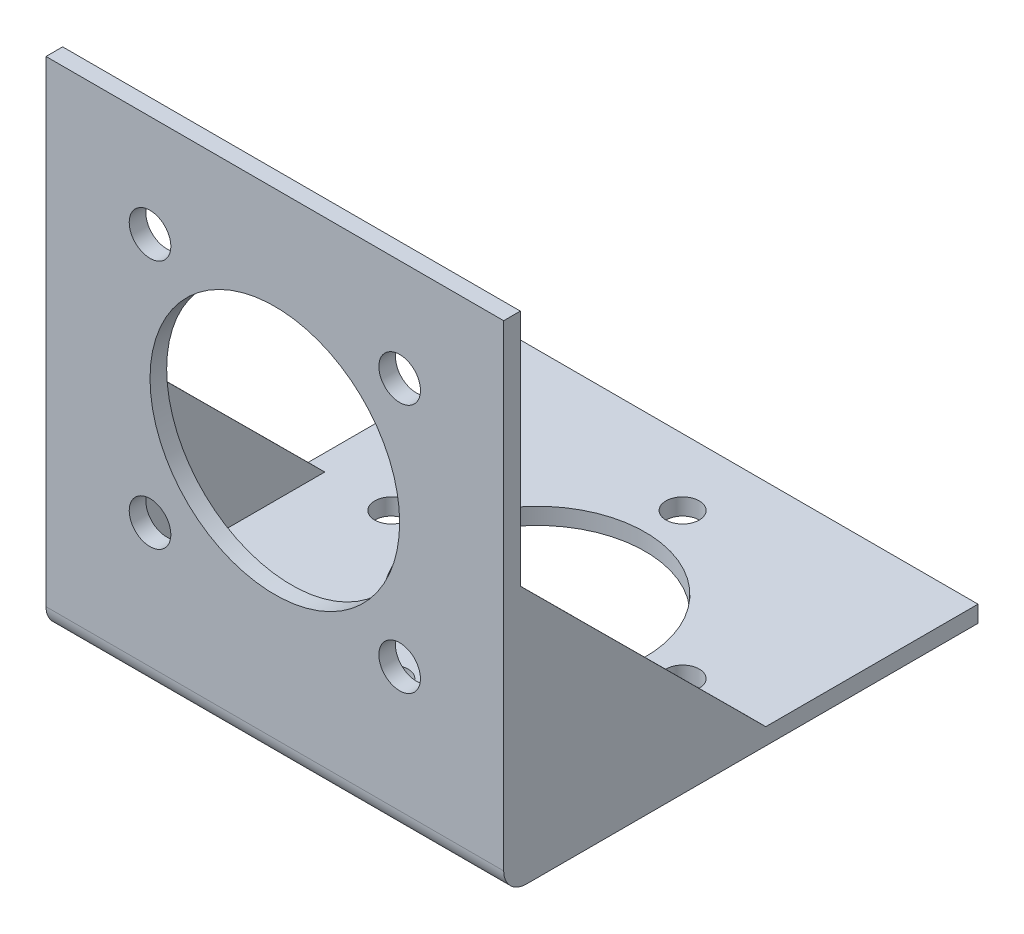
ISO-10303-21;
HEADER;
FILE_DESCRIPTION(('STEP AP214'),'2;1');
FILE_NAME('part.step','',(''),(''),'','','');
FILE_SCHEMA(('AUTOMOTIVE_DESIGN { 1 0 10303 214 1 1 1 1 }'));
ENDSEC;
DATA;
#1=APPLICATION_CONTEXT('core data for automotive mechanical design processes');
#2=APPLICATION_PROTOCOL_DEFINITION('international standard','automotive_design',2000,#1);
#3=PRODUCT_CONTEXT('',#1,'mechanical');
#4=PRODUCT('Part','Part','',(#3));
#5=PRODUCT_RELATED_PRODUCT_CATEGORY('part','',(#4));
#6=PRODUCT_DEFINITION_FORMATION('','',#4);
#7=PRODUCT_DEFINITION_CONTEXT('part definition',#1,'design');
#8=PRODUCT_DEFINITION('design','',#6,#7);
#9=PRODUCT_DEFINITION_SHAPE('','',#8);
#10=(LENGTH_UNIT() NAMED_UNIT(*) SI_UNIT(.MILLI.,.METRE.));
#11=(NAMED_UNIT(*) PLANE_ANGLE_UNIT() SI_UNIT($,.RADIAN.));
#12=(NAMED_UNIT(*) SI_UNIT($,.STERADIAN.) SOLID_ANGLE_UNIT());
#13=UNCERTAINTY_MEASURE_WITH_UNIT(LENGTH_MEASURE(1.E-05),#10,'distance_accuracy_value','');
#14=(GEOMETRIC_REPRESENTATION_CONTEXT(3) GLOBAL_UNCERTAINTY_ASSIGNED_CONTEXT((#13)) GLOBAL_UNIT_ASSIGNED_CONTEXT((#10,
#11,#12)) REPRESENTATION_CONTEXT('',''));
#15=CARTESIAN_POINT('',(0.,0.,0.));
#16=DIRECTION('',(0.,0.,1.));
#17=DIRECTION('',(1.,0.,0.));
#18=AXIS2_PLACEMENT_3D('',#15,#16,#17);
#19=CARTESIAN_POINT('',(27.5,0.736599999999997,28.7634));
#20=DIRECTION('',(1.,0.,0.));
#21=DIRECTION('',(0.,0.,1.));
#22=AXIS2_PLACEMENT_3D('',#19,#20,#21);
#23=CYLINDRICAL_SURFACE('',#22,0.736599999999997);
#24=CARTESIAN_POINT('',(-25.5,0.736599999999997,28.7634));
#25=DIRECTION('',(-1.,0.,0.));
#26=DIRECTION('',(0.,0.,1.));
#27=AXIS2_PLACEMENT_3D('',#24,#25,#26);
#28=CIRCLE('',#27,0.736599999999997);
#29=CARTESIAN_POINT('',(-25.5,0.736600000000004,29.5));
#30=VERTEX_POINT('',#29);
#31=CARTESIAN_POINT('',(-25.5,0.,28.7634));
#32=VERTEX_POINT('',#31);
#33=EDGE_CURVE('E227',#30,#32,#28,.F.);
#34=ORIENTED_EDGE('',*,*,#33,.F.);
#35=DIRECTION('',(1.,0.,0.));
#36=VECTOR('',#35,1.);
#37=CARTESIAN_POINT('',(-27.5,0.736599999999997,29.5));
#38=LINE('',#37,#36);
#39=CARTESIAN_POINT('',(25.5,0.736599999999997,29.5));
#40=VERTEX_POINT('',#39);
#41=EDGE_CURVE('E182',#30,#40,#38,.T.);
#42=ORIENTED_EDGE('',*,*,#41,.T.);
#43=CARTESIAN_POINT('',(25.5,0.736599999999997,28.7634));
#44=DIRECTION('',(-1.,0.,0.));
#45=DIRECTION('',(0.,0.,1.));
#46=AXIS2_PLACEMENT_3D('',#43,#44,#45);
#47=CIRCLE('',#46,0.736599999999997);
#48=CARTESIAN_POINT('',(25.5,0.,28.7634));
#49=VERTEX_POINT('',#48);
#50=EDGE_CURVE('E210',#40,#49,#47,.F.);
#51=ORIENTED_EDGE('',*,*,#50,.T.);
#52=DIRECTION('',(1.,0.,0.));
#53=VECTOR('',#52,1.);
#54=CARTESIAN_POINT('',(27.5,0.,28.7634));
#55=LINE('',#54,#53);
#56=EDGE_CURVE('E142',#49,#32,#55,.F.);
#57=ORIENTED_EDGE('',*,*,#56,.T.);
#58=EDGE_LOOP('',(#34,#42,#51,#57));
#59=FACE_BOUND('',#58,.T.);
#60=ADVANCED_FACE('F36',(#59),#23,.F.);
#61=CARTESIAN_POINT('',(27.5,-2.,-25.5));
#62=DIRECTION('',(1.,0.,0.));
#63=DIRECTION('',(0.,0.,-1.));
#64=AXIS2_PLACEMENT_3D('',#61,#62,#63);
#65=PLANE('',#64);
#66=DIRECTION('',(0.,0.,-1.));
#67=VECTOR('',#66,1.);
#68=CARTESIAN_POINT('',(27.5,-2.,-25.5));
#69=LINE('',#68,#67);
#70=CARTESIAN_POINT('',(27.5,-2.,28.7634));
#71=VERTEX_POINT('',#70);
#72=CARTESIAN_POINT('',(27.5,-2.,-25.5));
#73=VERTEX_POINT('',#72);
#74=EDGE_CURVE('E91',#71,#73,#69,.T.);
#75=ORIENTED_EDGE('',*,*,#74,.T.);
#76=DIRECTION('',(0.,1.,0.));
#77=VECTOR('',#76,1.);
#78=CARTESIAN_POINT('',(27.5,-2.,-25.5));
#79=LINE('',#78,#77);
#80=CARTESIAN_POINT('',(27.5,0.,-25.5));
#81=VERTEX_POINT('',#80);
#82=EDGE_CURVE('E78',#73,#81,#79,.T.);
#83=ORIENTED_EDGE('',*,*,#82,.T.);
#84=DIRECTION('',(0.,0.,-1.));
#85=VECTOR('',#84,1.);
#86=CARTESIAN_POINT('',(27.5,0.,-25.5));
#87=LINE('',#86,#85);
#88=CARTESIAN_POINT('',(27.5,0.,0.));
#89=VERTEX_POINT('',#88);
#90=EDGE_CURVE('E96',#89,#81,#87,.T.);
#91=ORIENTED_EDGE('',*,*,#90,.F.);
#92=DIRECTION('',(0.,0.705523078239169,0.708686945041269));
#93=VECTOR('',#92,1.);
#94=CARTESIAN_POINT('',(27.5,29.3683,29.5));
#95=LINE('',#94,#93);
#96=CARTESIAN_POINT('',(27.5,29.3683,29.5));
#97=VERTEX_POINT('',#96);
#98=EDGE_CURVE('E51',#89,#97,#95,.T.);
#99=ORIENTED_EDGE('',*,*,#98,.T.);
#100=DIRECTION('',(0.,1.,0.));
#101=VECTOR('',#100,1.);
#102=CARTESIAN_POINT('',(27.5,58.,29.5));
#103=LINE('',#102,#101);
#104=CARTESIAN_POINT('',(27.5,58.,29.5));
#105=VERTEX_POINT('',#104);
#106=EDGE_CURVE('E164',#97,#105,#103,.T.);
#107=ORIENTED_EDGE('',*,*,#106,.T.);
#108=DIRECTION('',(0.,0.,-1.));
#109=VECTOR('',#108,1.);
#110=CARTESIAN_POINT('',(27.5,58.,31.5));
#111=LINE('',#110,#109);
#112=CARTESIAN_POINT('',(27.5,58.,31.5));
#113=VERTEX_POINT('',#112);
#114=EDGE_CURVE('E146',#113,#105,#111,.T.);
#115=ORIENTED_EDGE('',*,*,#114,.F.);
#116=DIRECTION('',(0.,1.,0.));
#117=VECTOR('',#116,1.);
#118=CARTESIAN_POINT('',(27.5,58.,31.5));
#119=LINE('',#118,#117);
#120=CARTESIAN_POINT('',(27.5,0.736599999999997,31.5));
#121=VERTEX_POINT('',#120);
#122=EDGE_CURVE('E171',#121,#113,#119,.T.);
#123=ORIENTED_EDGE('',*,*,#122,.F.);
#124=CARTESIAN_POINT('',(27.5,0.736599999999997,28.7634));
#125=DIRECTION('',(1.,0.,0.));
#126=DIRECTION('',(0.,0.,-1.));
#127=AXIS2_PLACEMENT_3D('',#124,#125,#126);
#128=CIRCLE('',#127,2.7366);
#129=EDGE_CURVE('E145',#121,#71,#128,.T.);
#130=ORIENTED_EDGE('',*,*,#129,.T.);
#131=EDGE_LOOP('',(#75,#83,#91,#99,#107,#115,#123,#130));
#132=FACE_BOUND('',#131,.T.);
#133=ADVANCED_FACE('F38',(#132),#65,.T.);
#134=CARTESIAN_POINT('',(0.,-2.,0.));
#135=DIRECTION('',(0.,1.,0.));
#136=DIRECTION('',(0.,0.,1.));
#137=AXIS2_PLACEMENT_3D('',#134,#135,#136);
#138=PLANE('',#137);
#139=CARTESIAN_POINT('',(0.,-2.,0.));
#140=DIRECTION('',(0.,1.,0.));
#141=DIRECTION('',(0.,0.,1.));
#142=AXIS2_PLACEMENT_3D('',#139,#140,#141);
#143=CIRCLE('',#142,13.);
#144=CARTESIAN_POINT('',(0.,-2.,13.));
#145=VERTEX_POINT('',#144);
#146=EDGE_CURVE('E99',#145,#145,#143,.T.);
#147=ORIENTED_EDGE('',*,*,#146,.T.);
#148=EDGE_LOOP('',(#147));
#149=FACE_BOUND('',#148,.T.);
#150=CARTESIAN_POINT('',(17.5,-2.,0.));
#151=DIRECTION('',(0.,1.,0.));
#152=DIRECTION('',(0.,0.,1.));
#153=AXIS2_PLACEMENT_3D('',#150,#151,#152);
#154=CIRCLE('',#153,2.);
#155=CARTESIAN_POINT('',(17.5,-2.,2.));
#156=VERTEX_POINT('',#155);
#157=EDGE_CURVE('E110',#156,#156,#154,.T.);
#158=ORIENTED_EDGE('',*,*,#157,.T.);
#159=EDGE_LOOP('',(#158));
#160=FACE_BOUND('',#159,.T.);
#161=CARTESIAN_POINT('',(-17.5,-2.,0.));
#162=DIRECTION('',(0.,1.,0.));
#163=DIRECTION('',(0.,0.,1.));
#164=AXIS2_PLACEMENT_3D('',#161,#162,#163);
#165=CIRCLE('',#164,2.);
#166=CARTESIAN_POINT('',(-17.5,-2.,2.));
#167=VERTEX_POINT('',#166);
#168=EDGE_CURVE('E116',#167,#167,#165,.T.);
#169=ORIENTED_EDGE('',*,*,#168,.T.);
#170=EDGE_LOOP('',(#169));
#171=FACE_BOUND('',#170,.T.);
#172=CARTESIAN_POINT('',(0.,-2.,-17.5));
#173=DIRECTION('',(0.,1.,0.));
#174=DIRECTION('',(0.,0.,1.));
#175=AXIS2_PLACEMENT_3D('',#172,#173,#174);
#176=CIRCLE('',#175,2.);
#177=CARTESIAN_POINT('',(0.,-2.,-15.5));
#178=VERTEX_POINT('',#177);
#179=EDGE_CURVE('E122',#178,#178,#176,.T.);
#180=ORIENTED_EDGE('',*,*,#179,.T.);
#181=EDGE_LOOP('',(#180));
#182=FACE_BOUND('',#181,.T.);
#183=CARTESIAN_POINT('',(0.,-2.,17.5));
#184=DIRECTION('',(0.,1.,0.));
#185=DIRECTION('',(0.,0.,1.));
#186=AXIS2_PLACEMENT_3D('',#183,#184,#185);
#187=CIRCLE('',#186,2.);
#188=CARTESIAN_POINT('',(0.,-2.,19.5));
#189=VERTEX_POINT('',#188);
#190=EDGE_CURVE('E128',#189,#189,#187,.T.);
#191=ORIENTED_EDGE('',*,*,#190,.T.);
#192=EDGE_LOOP('',(#191));
#193=FACE_BOUND('',#192,.T.);
#194=DIRECTION('',(1.,0.,0.));
#195=VECTOR('',#194,1.);
#196=CARTESIAN_POINT('',(27.5,-2.,28.7634));
#197=LINE('',#196,#195);
#198=CARTESIAN_POINT('',(-27.5,-2.,28.7634));
#199=VERTEX_POINT('',#198);
#200=EDGE_CURVE('E149',#71,#199,#197,.F.);
#201=ORIENTED_EDGE('',*,*,#200,.T.);
#202=DIRECTION('',(0.,0.,1.));
#203=VECTOR('',#202,1.);
#204=CARTESIAN_POINT('',(-27.5,-2.,-25.5));
#205=LINE('',#204,#203);
#206=CARTESIAN_POINT('',(-27.5,-2.,-25.5));
#207=VERTEX_POINT('',#206);
#208=EDGE_CURVE('E102',#207,#199,#205,.T.);
#209=ORIENTED_EDGE('',*,*,#208,.F.);
#210=DIRECTION('',(-1.,0.,0.));
#211=VECTOR('',#210,1.);
#212=CARTESIAN_POINT('',(-27.5,-2.,-25.5));
#213=LINE('',#212,#211);
#214=EDGE_CURVE('E77',#73,#207,#213,.T.);
#215=ORIENTED_EDGE('',*,*,#214,.F.);
#216=ORIENTED_EDGE('',*,*,#74,.F.);
#217=EDGE_LOOP('',(#201,#209,#215,#216));
#218=FACE_BOUND('',#217,.T.);
#219=ADVANCED_FACE('F297',(#149,#160,#171,#182,#193,#218),#138,.F.);
#220=CARTESIAN_POINT('',(0.,0.,0.));
#221=DIRECTION('',(0.,1.,0.));
#222=DIRECTION('',(0.,0.,1.));
#223=AXIS2_PLACEMENT_3D('',#220,#221,#222);
#224=PLANE('',#223);
#225=DIRECTION('',(-1.,0.,0.));
#226=VECTOR('',#225,1.);
#227=CARTESIAN_POINT('',(-25.5,0.,0.));
#228=LINE('',#227,#226);
#229=CARTESIAN_POINT('',(-25.5,0.,0.));
#230=VERTEX_POINT('',#229);
#231=CARTESIAN_POINT('',(-27.5,0.,0.));
#232=VERTEX_POINT('',#231);
#233=EDGE_CURVE('E237',#230,#232,#228,.T.);
#234=ORIENTED_EDGE('',*,*,#233,.F.);
#235=DIRECTION('',(0.,0.,1.));
#236=VECTOR('',#235,1.);
#237=CARTESIAN_POINT('',(-25.5,0.,0.));
#238=LINE('',#237,#236);
#239=EDGE_CURVE('E241',#230,#32,#238,.T.);
#240=ORIENTED_EDGE('',*,*,#239,.T.);
#241=ORIENTED_EDGE('',*,*,#56,.F.);
#242=DIRECTION('',(0.,0.,-1.));
#243=VECTOR('',#242,1.);
#244=CARTESIAN_POINT('',(25.5,0.,0.));
#245=LINE('',#244,#243);
#246=CARTESIAN_POINT('',(25.5,0.,0.));
#247=VERTEX_POINT('',#246);
#248=EDGE_CURVE('E230',#49,#247,#245,.T.);
#249=ORIENTED_EDGE('',*,*,#248,.T.);
#250=DIRECTION('',(1.,0.,0.));
#251=VECTOR('',#250,1.);
#252=CARTESIAN_POINT('',(25.5,0.,0.));
#253=LINE('',#252,#251);
#254=EDGE_CURVE('E221',#247,#89,#253,.T.);
#255=ORIENTED_EDGE('',*,*,#254,.T.);
#256=ORIENTED_EDGE('',*,*,#90,.T.);
#257=DIRECTION('',(-1.,0.,0.));
#258=VECTOR('',#257,1.);
#259=CARTESIAN_POINT('',(-27.5,0.,-25.5));
#260=LINE('',#259,#258);
#261=CARTESIAN_POINT('',(-27.5,0.,-25.5));
#262=VERTEX_POINT('',#261);
#263=EDGE_CURVE('E75',#81,#262,#260,.T.);
#264=ORIENTED_EDGE('',*,*,#263,.T.);
#265=DIRECTION('',(0.,0.,1.));
#266=VECTOR('',#265,1.);
#267=CARTESIAN_POINT('',(-27.5,0.,-25.5));
#268=LINE('',#267,#266);
#269=EDGE_CURVE('E82',#262,#232,#268,.T.);
#270=ORIENTED_EDGE('',*,*,#269,.T.);
#271=EDGE_LOOP('',(#234,#240,#241,#249,#255,#256,#264,#270));
#272=FACE_BOUND('',#271,.T.);
#273=CARTESIAN_POINT('',(0.,0.,17.5));
#274=DIRECTION('',(0.,1.,0.));
#275=DIRECTION('',(0.,0.,1.));
#276=AXIS2_PLACEMENT_3D('',#273,#274,#275);
#277=CIRCLE('',#276,2.);
#278=CARTESIAN_POINT('',(0.,0.,19.5));
#279=VERTEX_POINT('',#278);
#280=EDGE_CURVE('E131',#279,#279,#277,.T.);
#281=ORIENTED_EDGE('',*,*,#280,.F.);
#282=EDGE_LOOP('',(#281));
#283=FACE_BOUND('',#282,.T.);
#284=CARTESIAN_POINT('',(0.,0.,-17.5));
#285=DIRECTION('',(0.,1.,0.));
#286=DIRECTION('',(0.,0.,1.));
#287=AXIS2_PLACEMENT_3D('',#284,#285,#286);
#288=CIRCLE('',#287,2.);
#289=CARTESIAN_POINT('',(0.,0.,-15.5));
#290=VERTEX_POINT('',#289);
#291=EDGE_CURVE('E125',#290,#290,#288,.T.);
#292=ORIENTED_EDGE('',*,*,#291,.F.);
#293=EDGE_LOOP('',(#292));
#294=FACE_BOUND('',#293,.T.);
#295=CARTESIAN_POINT('',(-17.5,0.,0.));
#296=DIRECTION('',(0.,1.,0.));
#297=DIRECTION('',(0.,0.,1.));
#298=AXIS2_PLACEMENT_3D('',#295,#296,#297);
#299=CIRCLE('',#298,2.);
#300=CARTESIAN_POINT('',(-17.5,0.,2.));
#301=VERTEX_POINT('',#300);
#302=EDGE_CURVE('E119',#301,#301,#299,.T.);
#303=ORIENTED_EDGE('',*,*,#302,.F.);
#304=EDGE_LOOP('',(#303));
#305=FACE_BOUND('',#304,.T.);
#306=CARTESIAN_POINT('',(17.5,0.,0.));
#307=DIRECTION('',(0.,1.,0.));
#308=DIRECTION('',(0.,0.,1.));
#309=AXIS2_PLACEMENT_3D('',#306,#307,#308);
#310=CIRCLE('',#309,2.);
#311=CARTESIAN_POINT('',(17.5,0.,2.));
#312=VERTEX_POINT('',#311);
#313=EDGE_CURVE('E113',#312,#312,#310,.T.);
#314=ORIENTED_EDGE('',*,*,#313,.F.);
#315=EDGE_LOOP('',(#314));
#316=FACE_BOUND('',#315,.T.);
#317=CARTESIAN_POINT('',(0.,0.,0.));
#318=DIRECTION('',(0.,1.,0.));
#319=DIRECTION('',(0.,0.,1.));
#320=AXIS2_PLACEMENT_3D('',#317,#318,#319);
#321=CIRCLE('',#320,13.);
#322=CARTESIAN_POINT('',(0.,0.,13.));
#323=VERTEX_POINT('',#322);
#324=EDGE_CURVE('E107',#323,#323,#321,.T.);
#325=ORIENTED_EDGE('',*,*,#324,.F.);
#326=EDGE_LOOP('',(#325));
#327=FACE_BOUND('',#326,.T.);
#328=ADVANCED_FACE('F93',(#272,#283,#294,#305,#316,#327),#224,.T.);
#329=CARTESIAN_POINT('',(-27.5,-2.,-25.5));
#330=DIRECTION('',(-1.,0.,0.));
#331=DIRECTION('',(0.,0.,1.));
#332=AXIS2_PLACEMENT_3D('',#329,#330,#331);
#333=PLANE('',#332);
#334=DIRECTION('',(0.,-1.,0.));
#335=VECTOR('',#334,1.);
#336=CARTESIAN_POINT('',(-27.5,0.,31.5));
#337=LINE('',#336,#335);
#338=CARTESIAN_POINT('',(-27.5,58.,31.5));
#339=VERTEX_POINT('',#338);
#340=CARTESIAN_POINT('',(-27.5,0.736599999999997,31.5));
#341=VERTEX_POINT('',#340);
#342=EDGE_CURVE('E163',#339,#341,#337,.T.);
#343=ORIENTED_EDGE('',*,*,#342,.F.);
#344=DIRECTION('',(0.,0.,-1.));
#345=VECTOR('',#344,1.);
#346=CARTESIAN_POINT('',(-27.5,58.,31.5));
#347=LINE('',#346,#345);
#348=CARTESIAN_POINT('',(-27.5,58.,29.5));
#349=VERTEX_POINT('',#348);
#350=EDGE_CURVE('E156',#339,#349,#347,.T.);
#351=ORIENTED_EDGE('',*,*,#350,.T.);
#352=DIRECTION('',(0.,-1.,0.));
#353=VECTOR('',#352,1.);
#354=CARTESIAN_POINT('',(-27.5,0.,29.5));
#355=LINE('',#354,#353);
#356=CARTESIAN_POINT('',(-27.5,29.3683,29.5));
#357=VERTEX_POINT('',#356);
#358=EDGE_CURVE('E166',#349,#357,#355,.T.);
#359=ORIENTED_EDGE('',*,*,#358,.T.);
#360=DIRECTION('',(0.,-0.705523078239169,-0.708686945041269));
#361=VECTOR('',#360,1.);
#362=CARTESIAN_POINT('',(-27.5,29.3683,29.5));
#363=LINE('',#362,#361);
#364=EDGE_CURVE('E88',#357,#232,#363,.T.);
#365=ORIENTED_EDGE('',*,*,#364,.T.);
#366=ORIENTED_EDGE('',*,*,#269,.F.);
#367=DIRECTION('',(0.,1.,0.));
#368=VECTOR('',#367,1.);
#369=CARTESIAN_POINT('',(-27.5,-2.,-25.5));
#370=LINE('',#369,#368);
#371=EDGE_CURVE('E44',#207,#262,#370,.T.);
#372=ORIENTED_EDGE('',*,*,#371,.F.);
#373=ORIENTED_EDGE('',*,*,#208,.T.);
#374=CARTESIAN_POINT('',(-27.5,0.736599999999997,28.7634));
#375=DIRECTION('',(1.,0.,0.));
#376=DIRECTION('',(0.,0.,-1.));
#377=AXIS2_PLACEMENT_3D('',#374,#375,#376);
#378=CIRCLE('',#377,2.7366);
#379=EDGE_CURVE('E140',#199,#341,#378,.F.);
#380=ORIENTED_EDGE('',*,*,#379,.T.);
#381=EDGE_LOOP('',(#343,#351,#359,#365,#366,#372,#373,#380));
#382=FACE_BOUND('',#381,.T.);
#383=ADVANCED_FACE('F84',(#382),#333,.T.);
#384=CARTESIAN_POINT('',(-27.5,-2.,-25.5));
#385=DIRECTION('',(0.,0.,-1.));
#386=DIRECTION('',(-1.,0.,0.));
#387=AXIS2_PLACEMENT_3D('',#384,#385,#386);
#388=PLANE('',#387);
#389=ORIENTED_EDGE('',*,*,#263,.F.);
#390=ORIENTED_EDGE('',*,*,#82,.F.);
#391=ORIENTED_EDGE('',*,*,#214,.T.);
#392=ORIENTED_EDGE('',*,*,#371,.T.);
#393=EDGE_LOOP('',(#389,#390,#391,#392));
#394=FACE_BOUND('',#393,.T.);
#395=ADVANCED_FACE('F72',(#394),#388,.T.);
#396=CARTESIAN_POINT('',(0.,-2.,0.));
#397=DIRECTION('',(0.,1.,0.));
#398=DIRECTION('',(0.,0.,1.));
#399=AXIS2_PLACEMENT_3D('',#396,#397,#398);
#400=CYLINDRICAL_SURFACE('',#399,13.);
#401=ORIENTED_EDGE('',*,*,#146,.F.);
#402=EDGE_LOOP('',(#401));
#403=FACE_BOUND('',#402,.T.);
#404=ORIENTED_EDGE('',*,*,#324,.T.);
#405=EDGE_LOOP('',(#404));
#406=FACE_BOUND('',#405,.T.);
#407=ADVANCED_FACE('F326',(#403,#406),#400,.F.);
#408=CARTESIAN_POINT('',(17.5,-2.,0.));
#409=DIRECTION('',(0.,1.,0.));
#410=DIRECTION('',(0.,0.,1.));
#411=AXIS2_PLACEMENT_3D('',#408,#409,#410);
#412=CYLINDRICAL_SURFACE('',#411,2.);
#413=ORIENTED_EDGE('',*,*,#157,.F.);
#414=EDGE_LOOP('',(#413));
#415=FACE_BOUND('',#414,.T.);
#416=ORIENTED_EDGE('',*,*,#313,.T.);
#417=EDGE_LOOP('',(#416));
#418=FACE_BOUND('',#417,.T.);
#419=ADVANCED_FACE('F322',(#415,#418),#412,.F.);
#420=CARTESIAN_POINT('',(-17.5,-2.,0.));
#421=DIRECTION('',(0.,1.,0.));
#422=DIRECTION('',(0.,0.,1.));
#423=AXIS2_PLACEMENT_3D('',#420,#421,#422);
#424=CYLINDRICAL_SURFACE('',#423,2.);
#425=ORIENTED_EDGE('',*,*,#168,.F.);
#426=EDGE_LOOP('',(#425));
#427=FACE_BOUND('',#426,.T.);
#428=ORIENTED_EDGE('',*,*,#302,.T.);
#429=EDGE_LOOP('',(#428));
#430=FACE_BOUND('',#429,.T.);
#431=ADVANCED_FACE('F318',(#427,#430),#424,.F.);
#432=CARTESIAN_POINT('',(0.,-2.,-17.5));
#433=DIRECTION('',(0.,1.,0.));
#434=DIRECTION('',(0.,0.,1.));
#435=AXIS2_PLACEMENT_3D('',#432,#433,#434);
#436=CYLINDRICAL_SURFACE('',#435,2.);
#437=ORIENTED_EDGE('',*,*,#179,.F.);
#438=EDGE_LOOP('',(#437));
#439=FACE_BOUND('',#438,.T.);
#440=ORIENTED_EDGE('',*,*,#291,.T.);
#441=EDGE_LOOP('',(#440));
#442=FACE_BOUND('',#441,.T.);
#443=ADVANCED_FACE('F314',(#439,#442),#436,.F.);
#444=CARTESIAN_POINT('',(0.,-2.,17.5));
#445=DIRECTION('',(0.,1.,0.));
#446=DIRECTION('',(0.,0.,1.));
#447=AXIS2_PLACEMENT_3D('',#444,#445,#446);
#448=CYLINDRICAL_SURFACE('',#447,2.);
#449=ORIENTED_EDGE('',*,*,#190,.F.);
#450=EDGE_LOOP('',(#449));
#451=FACE_BOUND('',#450,.T.);
#452=ORIENTED_EDGE('',*,*,#280,.T.);
#453=EDGE_LOOP('',(#452));
#454=FACE_BOUND('',#453,.T.);
#455=ADVANCED_FACE('F311',(#451,#454),#448,.F.);
#456=CARTESIAN_POINT('',(27.5,0.736599999999997,28.7634));
#457=DIRECTION('',(1.,0.,0.));
#458=DIRECTION('',(0.,0.,1.));
#459=AXIS2_PLACEMENT_3D('',#456,#457,#458);
#460=CYLINDRICAL_SURFACE('',#459,2.7366);
#461=ORIENTED_EDGE('',*,*,#200,.F.);
#462=ORIENTED_EDGE('',*,*,#129,.F.);
#463=DIRECTION('',(-1.,0.,0.));
#464=VECTOR('',#463,1.);
#465=CARTESIAN_POINT('',(0.,0.736599999999997,31.5));
#466=LINE('',#465,#464);
#467=EDGE_CURVE('E168',#121,#341,#466,.T.);
#468=ORIENTED_EDGE('',*,*,#467,.T.);
#469=ORIENTED_EDGE('',*,*,#379,.F.);
#470=EDGE_LOOP('',(#461,#462,#468,#469));
#471=FACE_BOUND('',#470,.T.);
#472=ADVANCED_FACE('F309',(#471),#460,.T.);
#473=CARTESIAN_POINT('',(0.,0.,31.5));
#474=DIRECTION('',(0.,0.,-1.));
#475=DIRECTION('',(-1.,0.,0.));
#476=AXIS2_PLACEMENT_3D('',#473,#474,#475);
#477=PLANE('',#476);
#478=CARTESIAN_POINT('',(15.,45.7365999999999,31.5));
#479=DIRECTION('',(0.,0.,-1.));
#480=DIRECTION('',(-1.,0.,0.));
#481=AXIS2_PLACEMENT_3D('',#478,#479,#480);
#482=CIRCLE('',#481,2.5);
#483=CARTESIAN_POINT('',(12.5,45.7365999999999,31.5));
#484=VERTEX_POINT('',#483);
#485=EDGE_CURVE('E193',#484,#484,#482,.T.);
#486=ORIENTED_EDGE('',*,*,#485,.T.);
#487=EDGE_LOOP('',(#486));
#488=FACE_BOUND('',#487,.T.);
#489=CARTESIAN_POINT('',(15.0000000000001,15.7366,31.5));
#490=DIRECTION('',(0.,0.,-1.));
#491=DIRECTION('',(-1.,0.,0.));
#492=AXIS2_PLACEMENT_3D('',#489,#490,#491);
#493=CIRCLE('',#492,2.5);
#494=CARTESIAN_POINT('',(12.5000000000001,15.7366,31.5));
#495=VERTEX_POINT('',#494);
#496=EDGE_CURVE('E196',#495,#495,#493,.T.);
#497=ORIENTED_EDGE('',*,*,#496,.T.);
#498=EDGE_LOOP('',(#497));
#499=FACE_BOUND('',#498,.T.);
#500=CARTESIAN_POINT('',(-15.0000000000001,15.7366,31.5));
#501=DIRECTION('',(0.,0.,-1.));
#502=DIRECTION('',(-1.,0.,0.));
#503=AXIS2_PLACEMENT_3D('',#500,#501,#502);
#504=CIRCLE('',#503,2.5);
#505=CARTESIAN_POINT('',(-17.5000000000001,15.7366,31.5));
#506=VERTEX_POINT('',#505);
#507=EDGE_CURVE('E199',#506,#506,#504,.T.);
#508=ORIENTED_EDGE('',*,*,#507,.T.);
#509=EDGE_LOOP('',(#508));
#510=FACE_BOUND('',#509,.T.);
#511=CARTESIAN_POINT('',(-15.,45.7366,31.5));
#512=DIRECTION('',(0.,0.,-1.));
#513=DIRECTION('',(-1.,0.,0.));
#514=AXIS2_PLACEMENT_3D('',#511,#512,#513);
#515=CIRCLE('',#514,2.5);
#516=CARTESIAN_POINT('',(-17.5,45.7366,31.5));
#517=VERTEX_POINT('',#516);
#518=EDGE_CURVE('E202',#517,#517,#515,.T.);
#519=ORIENTED_EDGE('',*,*,#518,.T.);
#520=EDGE_LOOP('',(#519));
#521=FACE_BOUND('',#520,.T.);
#522=CARTESIAN_POINT('',(0.,30.7366,31.5));
#523=DIRECTION('',(0.,0.,-1.));
#524=DIRECTION('',(-1.,0.,0.));
#525=AXIS2_PLACEMENT_3D('',#522,#523,#524);
#526=CIRCLE('',#525,15.);
#527=CARTESIAN_POINT('',(-15.,30.7366,31.5));
#528=VERTEX_POINT('',#527);
#529=EDGE_CURVE('E183',#528,#528,#526,.T.);
#530=ORIENTED_EDGE('',*,*,#529,.T.);
#531=EDGE_LOOP('',(#530));
#532=FACE_BOUND('',#531,.T.);
#533=ORIENTED_EDGE('',*,*,#467,.F.);
#534=ORIENTED_EDGE('',*,*,#122,.T.);
#535=DIRECTION('',(-1.,0.,0.));
#536=VECTOR('',#535,1.);
#537=CARTESIAN_POINT('',(-27.5,58.,31.5));
#538=LINE('',#537,#536);
#539=EDGE_CURVE('E159',#113,#339,#538,.T.);
#540=ORIENTED_EDGE('',*,*,#539,.T.);
#541=ORIENTED_EDGE('',*,*,#342,.T.);
#542=EDGE_LOOP('',(#533,#534,#540,#541));
#543=FACE_BOUND('',#542,.T.);
#544=ADVANCED_FACE('F366',(#488,#499,#510,#521,#532,#543),#477,.F.);
#545=CARTESIAN_POINT('',(0.,0.,29.5));
#546=DIRECTION('',(0.,0.,-1.));
#547=DIRECTION('',(-1.,0.,0.));
#548=AXIS2_PLACEMENT_3D('',#545,#546,#547);
#549=PLANE('',#548);
#550=DIRECTION('',(-1.,0.,0.));
#551=VECTOR('',#550,1.);
#552=CARTESIAN_POINT('',(-25.5,29.3683,29.5));
#553=LINE('',#552,#551);
#554=CARTESIAN_POINT('',(-25.5,29.3683,29.5));
#555=VERTEX_POINT('',#554);
#556=EDGE_CURVE('E238',#555,#357,#553,.T.);
#557=ORIENTED_EDGE('',*,*,#556,.T.);
#558=ORIENTED_EDGE('',*,*,#358,.F.);
#559=DIRECTION('',(-1.,0.,0.));
#560=VECTOR('',#559,1.);
#561=CARTESIAN_POINT('',(-27.5,58.,29.5));
#562=LINE('',#561,#560);
#563=EDGE_CURVE('E160',#105,#349,#562,.T.);
#564=ORIENTED_EDGE('',*,*,#563,.F.);
#565=ORIENTED_EDGE('',*,*,#106,.F.);
#566=DIRECTION('',(1.,0.,0.));
#567=VECTOR('',#566,1.);
#568=CARTESIAN_POINT('',(25.5,29.3683,29.5));
#569=LINE('',#568,#567);
#570=CARTESIAN_POINT('',(25.5,29.3683,29.5));
#571=VERTEX_POINT('',#570);
#572=EDGE_CURVE('E220',#571,#97,#569,.T.);
#573=ORIENTED_EDGE('',*,*,#572,.F.);
#574=DIRECTION('',(0.,-1.,0.));
#575=VECTOR('',#574,1.);
#576=CARTESIAN_POINT('',(25.5,29.3683,29.5));
#577=LINE('',#576,#575);
#578=EDGE_CURVE('E226',#571,#40,#577,.T.);
#579=ORIENTED_EDGE('',*,*,#578,.T.);
#580=ORIENTED_EDGE('',*,*,#41,.F.);
#581=DIRECTION('',(0.,1.,0.));
#582=VECTOR('',#581,1.);
#583=CARTESIAN_POINT('',(-25.5,0.,29.5));
#584=LINE('',#583,#582);
#585=EDGE_CURVE('E11',#30,#555,#584,.T.);
#586=ORIENTED_EDGE('',*,*,#585,.T.);
#587=EDGE_LOOP('',(#557,#558,#564,#565,#573,#579,#580,#586));
#588=FACE_BOUND('',#587,.T.);
#589=CARTESIAN_POINT('',(15.,45.7365999999999,29.5));
#590=DIRECTION('',(0.,0.,-1.));
#591=DIRECTION('',(-1.,0.,0.));
#592=AXIS2_PLACEMENT_3D('',#589,#590,#591);
#593=CIRCLE('',#592,2.5);
#594=CARTESIAN_POINT('',(12.5,45.7365999999999,29.5));
#595=VERTEX_POINT('',#594);
#596=EDGE_CURVE('E205',#595,#595,#593,.T.);
#597=ORIENTED_EDGE('',*,*,#596,.F.);
#598=EDGE_LOOP('',(#597));
#599=FACE_BOUND('',#598,.T.);
#600=CARTESIAN_POINT('',(15.0000000000001,15.7366,29.5));
#601=DIRECTION('',(0.,0.,-1.));
#602=DIRECTION('',(-1.,0.,0.));
#603=AXIS2_PLACEMENT_3D('',#600,#601,#602);
#604=CIRCLE('',#603,2.5);
#605=CARTESIAN_POINT('',(12.5000000000001,15.7366,29.5));
#606=VERTEX_POINT('',#605);
#607=EDGE_CURVE('E213',#606,#606,#604,.T.);
#608=ORIENTED_EDGE('',*,*,#607,.F.);
#609=EDGE_LOOP('',(#608));
#610=FACE_BOUND('',#609,.T.);
#611=CARTESIAN_POINT('',(-15.0000000000001,15.7366,29.5));
#612=DIRECTION('',(0.,0.,-1.));
#613=DIRECTION('',(-1.,0.,0.));
#614=AXIS2_PLACEMENT_3D('',#611,#612,#613);
#615=CIRCLE('',#614,2.5);
#616=CARTESIAN_POINT('',(-17.5000000000001,15.7366,29.5));
#617=VERTEX_POINT('',#616);
#618=EDGE_CURVE('E209',#617,#617,#615,.T.);
#619=ORIENTED_EDGE('',*,*,#618,.F.);
#620=EDGE_LOOP('',(#619));
#621=FACE_BOUND('',#620,.T.);
#622=CARTESIAN_POINT('',(-15.,45.7366,29.5));
#623=DIRECTION('',(0.,0.,-1.));
#624=DIRECTION('',(-1.,0.,0.));
#625=AXIS2_PLACEMENT_3D('',#622,#623,#624);
#626=CIRCLE('',#625,2.5);
#627=CARTESIAN_POINT('',(-17.5,45.7366,29.5));
#628=VERTEX_POINT('',#627);
#629=EDGE_CURVE('E206',#628,#628,#626,.T.);
#630=ORIENTED_EDGE('',*,*,#629,.F.);
#631=EDGE_LOOP('',(#630));
#632=FACE_BOUND('',#631,.T.);
#633=CARTESIAN_POINT('',(0.,30.7366,29.5));
#634=DIRECTION('',(0.,0.,-1.));
#635=DIRECTION('',(-1.,0.,0.));
#636=AXIS2_PLACEMENT_3D('',#633,#634,#635);
#637=CIRCLE('',#636,15.);
#638=CARTESIAN_POINT('',(-15.,30.7366,29.5));
#639=VERTEX_POINT('',#638);
#640=EDGE_CURVE('E190',#639,#639,#637,.T.);
#641=ORIENTED_EDGE('',*,*,#640,.F.);
#642=EDGE_LOOP('',(#641));
#643=FACE_BOUND('',#642,.T.);
#644=ADVANCED_FACE('F284',(#588,#599,#610,#621,#632,#643),#549,.T.);
#645=CARTESIAN_POINT('',(-27.5,58.,31.5));
#646=DIRECTION('',(0.,-1.,0.));
#647=DIRECTION('',(0.,0.,-1.));
#648=AXIS2_PLACEMENT_3D('',#645,#646,#647);
#649=PLANE('',#648);
#650=ORIENTED_EDGE('',*,*,#563,.T.);
#651=ORIENTED_EDGE('',*,*,#350,.F.);
#652=ORIENTED_EDGE('',*,*,#539,.F.);
#653=ORIENTED_EDGE('',*,*,#114,.T.);
#654=EDGE_LOOP('',(#650,#651,#652,#653));
#655=FACE_BOUND('',#654,.T.);
#656=ADVANCED_FACE('F382',(#655),#649,.F.);
#657=CARTESIAN_POINT('',(0.,30.7366,39.5));
#658=DIRECTION('',(0.,0.,-1.));
#659=DIRECTION('',(-1.,0.,0.));
#660=AXIS2_PLACEMENT_3D('',#657,#658,#659);
#661=CYLINDRICAL_SURFACE('',#660,15.);
#662=ORIENTED_EDGE('',*,*,#640,.T.);
#663=EDGE_LOOP('',(#662));
#664=FACE_BOUND('',#663,.T.);
#665=ORIENTED_EDGE('',*,*,#529,.F.);
#666=EDGE_LOOP('',(#665));
#667=FACE_BOUND('',#666,.T.);
#668=ADVANCED_FACE('F389',(#664,#667),#661,.F.);
#669=CARTESIAN_POINT('',(-15.,45.7366,39.5));
#670=DIRECTION('',(0.,0.,-1.));
#671=DIRECTION('',(-1.,0.,0.));
#672=AXIS2_PLACEMENT_3D('',#669,#670,#671);
#673=CYLINDRICAL_SURFACE('',#672,2.5);
#674=ORIENTED_EDGE('',*,*,#629,.T.);
#675=EDGE_LOOP('',(#674));
#676=FACE_BOUND('',#675,.T.);
#677=ORIENTED_EDGE('',*,*,#518,.F.);
#678=EDGE_LOOP('',(#677));
#679=FACE_BOUND('',#678,.T.);
#680=ADVANCED_FACE('F395',(#676,#679),#673,.F.);
#681=CARTESIAN_POINT('',(-15.0000000000001,15.7366,39.5));
#682=DIRECTION('',(0.,0.,-1.));
#683=DIRECTION('',(-1.,0.,0.));
#684=AXIS2_PLACEMENT_3D('',#681,#682,#683);
#685=CYLINDRICAL_SURFACE('',#684,2.5);
#686=ORIENTED_EDGE('',*,*,#618,.T.);
#687=EDGE_LOOP('',(#686));
#688=FACE_BOUND('',#687,.T.);
#689=ORIENTED_EDGE('',*,*,#507,.F.);
#690=EDGE_LOOP('',(#689));
#691=FACE_BOUND('',#690,.T.);
#692=ADVANCED_FACE('F403',(#688,#691),#685,.F.);
#693=CARTESIAN_POINT('',(15.0000000000001,15.7366,39.5));
#694=DIRECTION('',(0.,0.,-1.));
#695=DIRECTION('',(-1.,0.,0.));
#696=AXIS2_PLACEMENT_3D('',#693,#694,#695);
#697=CYLINDRICAL_SURFACE('',#696,2.5);
#698=ORIENTED_EDGE('',*,*,#607,.T.);
#699=EDGE_LOOP('',(#698));
#700=FACE_BOUND('',#699,.T.);
#701=ORIENTED_EDGE('',*,*,#496,.F.);
#702=EDGE_LOOP('',(#701));
#703=FACE_BOUND('',#702,.T.);
#704=ADVANCED_FACE('F411',(#700,#703),#697,.F.);
#705=CARTESIAN_POINT('',(15.,45.7365999999999,39.5));
#706=DIRECTION('',(0.,0.,-1.));
#707=DIRECTION('',(-1.,0.,0.));
#708=AXIS2_PLACEMENT_3D('',#705,#706,#707);
#709=CYLINDRICAL_SURFACE('',#708,2.5);
#710=ORIENTED_EDGE('',*,*,#596,.T.);
#711=EDGE_LOOP('',(#710));
#712=FACE_BOUND('',#711,.T.);
#713=ORIENTED_EDGE('',*,*,#485,.F.);
#714=EDGE_LOOP('',(#713));
#715=FACE_BOUND('',#714,.T.);
#716=ADVANCED_FACE('F419',(#712,#715),#709,.F.);
#717=CARTESIAN_POINT('',(25.5,0.,0.));
#718=DIRECTION('',(-1.,0.,0.));
#719=DIRECTION('',(0.,0.,1.));
#720=AXIS2_PLACEMENT_3D('',#717,#718,#719);
#721=PLANE('',#720);
#722=ORIENTED_EDGE('',*,*,#50,.F.);
#723=ORIENTED_EDGE('',*,*,#578,.F.);
#724=DIRECTION('',(0.,0.705523078239169,0.708686945041269));
#725=VECTOR('',#724,1.);
#726=CARTESIAN_POINT('',(25.5,29.3683,29.5));
#727=LINE('',#726,#725);
#728=EDGE_CURVE('E223',#247,#571,#727,.T.);
#729=ORIENTED_EDGE('',*,*,#728,.F.);
#730=ORIENTED_EDGE('',*,*,#248,.F.);
#731=EDGE_LOOP('',(#722,#723,#729,#730));
#732=FACE_BOUND('',#731,.T.);
#733=ADVANCED_FACE('F277',(#732),#721,.T.);
#734=CARTESIAN_POINT('',(25.5,29.3683,29.5));
#735=DIRECTION('',(0.,0.708686945041269,-0.705523078239169));
#736=DIRECTION('',(0.,0.705523078239169,0.708686945041269));
#737=AXIS2_PLACEMENT_3D('',#734,#735,#736);
#738=PLANE('',#737);
#739=ORIENTED_EDGE('',*,*,#98,.F.);
#740=ORIENTED_EDGE('',*,*,#254,.F.);
#741=ORIENTED_EDGE('',*,*,#728,.T.);
#742=ORIENTED_EDGE('',*,*,#572,.T.);
#743=EDGE_LOOP('',(#739,#740,#741,#742));
#744=FACE_BOUND('',#743,.T.);
#745=ADVANCED_FACE('F292',(#744),#738,.T.);
#746=CARTESIAN_POINT('',(-25.5,0.,0.));
#747=DIRECTION('',(-1.,0.,0.));
#748=DIRECTION('',(0.,0.,1.));
#749=AXIS2_PLACEMENT_3D('',#746,#747,#748);
#750=PLANE('',#749);
#751=ORIENTED_EDGE('',*,*,#585,.F.);
#752=ORIENTED_EDGE('',*,*,#33,.T.);
#753=ORIENTED_EDGE('',*,*,#239,.F.);
#754=DIRECTION('',(0.,-0.705523078239169,-0.708686945041269));
#755=VECTOR('',#754,1.);
#756=CARTESIAN_POINT('',(-25.5,29.3683,29.5));
#757=LINE('',#756,#755);
#758=EDGE_CURVE('E245',#555,#230,#757,.T.);
#759=ORIENTED_EDGE('',*,*,#758,.F.);
#760=EDGE_LOOP('',(#751,#752,#753,#759));
#761=FACE_BOUND('',#760,.T.);
#762=ADVANCED_FACE('F260',(#761),#750,.F.);
#763=CARTESIAN_POINT('',(-25.5,29.3683,29.5));
#764=DIRECTION('',(0.,0.708686945041269,-0.705523078239169));
#765=DIRECTION('',(0.,0.705523078239169,0.708686945041269));
#766=AXIS2_PLACEMENT_3D('',#763,#764,#765);
#767=PLANE('',#766);
#768=ORIENTED_EDGE('',*,*,#364,.F.);
#769=ORIENTED_EDGE('',*,*,#556,.F.);
#770=ORIENTED_EDGE('',*,*,#758,.T.);
#771=ORIENTED_EDGE('',*,*,#233,.T.);
#772=EDGE_LOOP('',(#768,#769,#770,#771));
#773=FACE_BOUND('',#772,.T.);
#774=ADVANCED_FACE('F254',(#773),#767,.T.);
#775=CLOSED_SHELL('',(#60,#133,#219,#328,#383,#395,#407,#419,#431,#443,#455,#472,#544,#644,#656,
#668,#680,#692,#704,#716,#733,#745,#762,#774));
#776=MANIFOLD_SOLID_BREP('B2',#775);
#777=ADVANCED_BREP_SHAPE_REPRESENTATION('',(#18,#776),#14);
#778=SHAPE_DEFINITION_REPRESENTATION(#9,#777);
ENDSEC;
END-ISO-10303-21;
